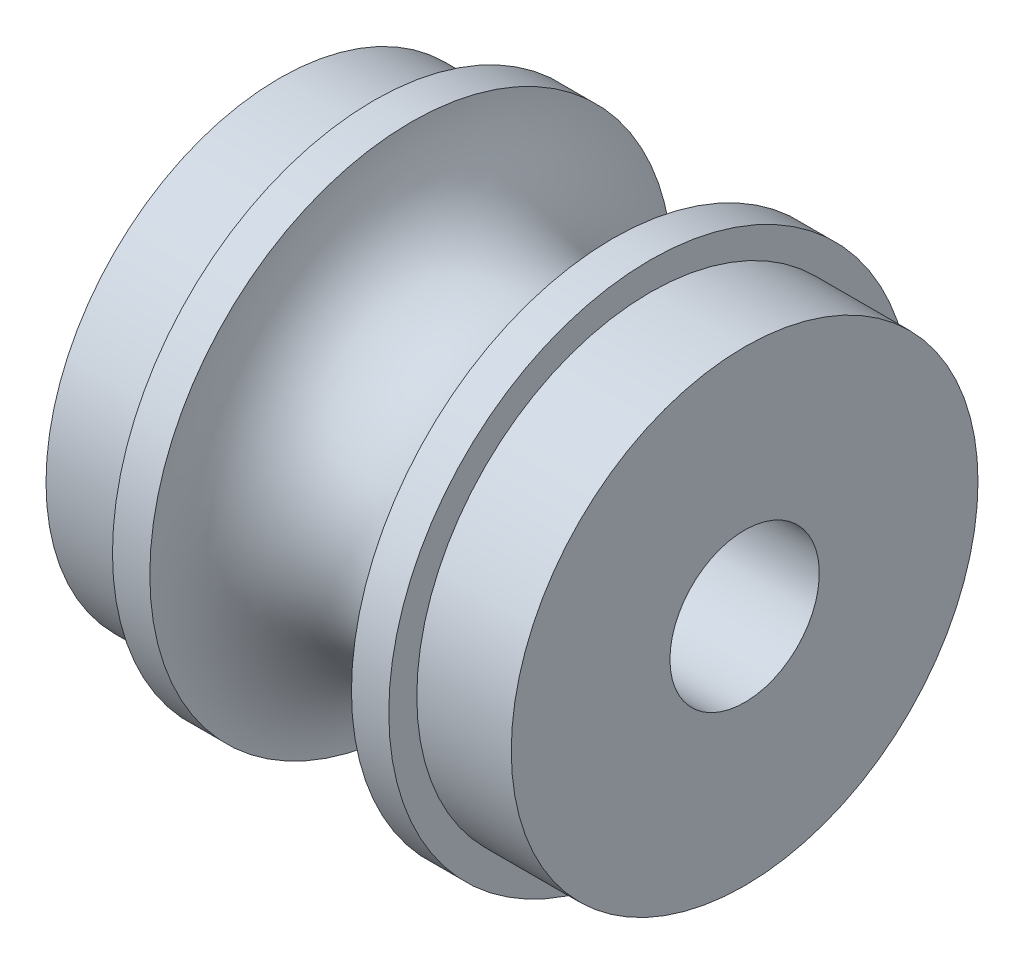
ISO-10303-21;
HEADER;
FILE_DESCRIPTION(('STEP AP214'),'2;1');
FILE_NAME('part.step','',(''),(''),'','','');
FILE_SCHEMA(('AUTOMOTIVE_DESIGN { 1 0 10303 214 1 1 1 1 }'));
ENDSEC;
DATA;
#1=APPLICATION_CONTEXT('core data for automotive mechanical design processes');
#2=APPLICATION_PROTOCOL_DEFINITION('international standard','automotive_design',2000,#1);
#3=PRODUCT_CONTEXT('',#1,'mechanical');
#4=PRODUCT('Part','Part','',(#3));
#5=PRODUCT_RELATED_PRODUCT_CATEGORY('part','',(#4));
#6=PRODUCT_DEFINITION_FORMATION('','',#4);
#7=PRODUCT_DEFINITION_CONTEXT('part definition',#1,'design');
#8=PRODUCT_DEFINITION('design','',#6,#7);
#9=PRODUCT_DEFINITION_SHAPE('','',#8);
#10=(LENGTH_UNIT() NAMED_UNIT(*) SI_UNIT(.MILLI.,.METRE.));
#11=(NAMED_UNIT(*) PLANE_ANGLE_UNIT() SI_UNIT($,.RADIAN.));
#12=(NAMED_UNIT(*) SI_UNIT($,.STERADIAN.) SOLID_ANGLE_UNIT());
#13=UNCERTAINTY_MEASURE_WITH_UNIT(LENGTH_MEASURE(1.E-05),#10,'distance_accuracy_value','');
#14=(GEOMETRIC_REPRESENTATION_CONTEXT(3) GLOBAL_UNCERTAINTY_ASSIGNED_CONTEXT((#13)) GLOBAL_UNIT_ASSIGNED_CONTEXT((#10,
#11,#12)) REPRESENTATION_CONTEXT('',''));
#15=CARTESIAN_POINT('',(0.,0.,0.));
#16=DIRECTION('',(0.,0.,1.));
#17=DIRECTION('',(1.,0.,0.));
#18=AXIS2_PLACEMENT_3D('',#15,#16,#17);
#19=CARTESIAN_POINT('',(3.429,0.,0.));
#20=DIRECTION('',(-1.,0.,0.));
#21=DIRECTION('',(0.,0.,1.));
#22=AXIS2_PLACEMENT_3D('',#19,#20,#21);
#23=TOROIDAL_SURFACE('',#22,8.89,3.429);
#24=CARTESIAN_POINT('',(6.858,0.,0.));
#25=DIRECTION('',(-1.,0.,0.));
#26=DIRECTION('',(0.,0.,1.));
#27=AXIS2_PLACEMENT_3D('',#24,#25,#26);
#28=CIRCLE('',#27,8.89);
#29=CARTESIAN_POINT('',(6.858,0.,8.89));
#30=VERTEX_POINT('',#29);
#31=EDGE_CURVE('E61',#30,#30,#28,.T.);
#32=ORIENTED_EDGE('',*,*,#31,.T.);
#33=EDGE_LOOP('',(#32));
#34=FACE_BOUND('',#33,.T.);
#35=CARTESIAN_POINT('',(0.,0.,0.));
#36=DIRECTION('',(-1.,0.,0.));
#37=DIRECTION('',(0.,0.,1.));
#38=AXIS2_PLACEMENT_3D('',#35,#36,#37);
#39=CIRCLE('',#38,8.89);
#40=CARTESIAN_POINT('',(0.,0.,8.89));
#41=VERTEX_POINT('',#40);
#42=EDGE_CURVE('E42',#41,#41,#39,.T.);
#43=ORIENTED_EDGE('',*,*,#42,.F.);
#44=EDGE_LOOP('',(#43));
#45=FACE_BOUND('',#44,.T.);
#46=ADVANCED_FACE('F39',(#34,#45),#23,.F.);
#47=CARTESIAN_POINT('',(0.,0.,0.));
#48=DIRECTION('',(-1.,0.,0.));
#49=DIRECTION('',(0.,0.,1.));
#50=AXIS2_PLACEMENT_3D('',#47,#48,#49);
#51=CYLINDRICAL_SURFACE('',#50,8.89);
#52=CARTESIAN_POINT('',(-1.27,0.,0.));
#53=DIRECTION('',(-1.,0.,0.));
#54=DIRECTION('',(0.,0.,1.));
#55=AXIS2_PLACEMENT_3D('',#52,#53,#54);
#56=CIRCLE('',#55,8.89);
#57=CARTESIAN_POINT('',(-1.27,0.,8.89));
#58=VERTEX_POINT('',#57);
#59=EDGE_CURVE('E69',#58,#58,#56,.T.);
#60=ORIENTED_EDGE('',*,*,#59,.F.);
#61=EDGE_LOOP('',(#60));
#62=FACE_BOUND('',#61,.T.);
#63=ORIENTED_EDGE('',*,*,#42,.T.);
#64=EDGE_LOOP('',(#63));
#65=FACE_BOUND('',#64,.T.);
#66=ADVANCED_FACE('F78',(#62,#65),#51,.T.);
#67=CARTESIAN_POINT('',(-1.27,0.,0.));
#68=DIRECTION('',(-1.,0.,0.));
#69=DIRECTION('',(0.,0.,1.));
#70=AXIS2_PLACEMENT_3D('',#67,#68,#69);
#71=PLANE('',#70);
#72=CARTESIAN_POINT('',(-1.27,0.,0.));
#73=DIRECTION('',(-1.,0.,0.));
#74=DIRECTION('',(0.,0.,1.));
#75=AXIS2_PLACEMENT_3D('',#72,#73,#74);
#76=CIRCLE('',#75,7.9375);
#77=CARTESIAN_POINT('',(-1.27,0.,7.9375));
#78=VERTEX_POINT('',#77);
#79=EDGE_CURVE('E10',#78,#78,#76,.T.);
#80=ORIENTED_EDGE('',*,*,#79,.F.);
#81=EDGE_LOOP('',(#80));
#82=FACE_BOUND('',#81,.T.);
#83=ORIENTED_EDGE('',*,*,#59,.T.);
#84=EDGE_LOOP('',(#83));
#85=FACE_BOUND('',#84,.T.);
#86=ADVANCED_FACE('F85',(#82,#85),#71,.T.);
#87=CARTESIAN_POINT('',(8.128,0.,0.));
#88=DIRECTION('',(1.,0.,0.));
#89=DIRECTION('',(0.,0.,-1.));
#90=AXIS2_PLACEMENT_3D('',#87,#88,#89);
#91=PLANE('',#90);
#92=CARTESIAN_POINT('',(8.128,0.,0.));
#93=DIRECTION('',(1.,0.,0.));
#94=DIRECTION('',(0.,0.,-1.));
#95=AXIS2_PLACEMENT_3D('',#92,#93,#94);
#96=CIRCLE('',#95,7.9375);
#97=CARTESIAN_POINT('',(8.128,0.,-7.9375));
#98=VERTEX_POINT('',#97);
#99=EDGE_CURVE('E47',#98,#98,#96,.T.);
#100=ORIENTED_EDGE('',*,*,#99,.F.);
#101=EDGE_LOOP('',(#100));
#102=FACE_BOUND('',#101,.T.);
#103=CARTESIAN_POINT('',(8.128,0.,0.));
#104=DIRECTION('',(-1.,0.,0.));
#105=DIRECTION('',(0.,0.,1.));
#106=AXIS2_PLACEMENT_3D('',#103,#104,#105);
#107=CIRCLE('',#106,8.89);
#108=CARTESIAN_POINT('',(8.128,0.,8.89));
#109=VERTEX_POINT('',#108);
#110=EDGE_CURVE('E66',#109,#109,#107,.T.);
#111=ORIENTED_EDGE('',*,*,#110,.F.);
#112=EDGE_LOOP('',(#111));
#113=FACE_BOUND('',#112,.T.);
#114=ADVANCED_FACE('F92',(#102,#113),#91,.T.);
#115=CARTESIAN_POINT('',(0.,0.,0.));
#116=DIRECTION('',(-1.,0.,0.));
#117=DIRECTION('',(0.,0.,1.));
#118=AXIS2_PLACEMENT_3D('',#115,#116,#117);
#119=CYLINDRICAL_SURFACE('',#118,8.89);
#120=ORIENTED_EDGE('',*,*,#110,.T.);
#121=EDGE_LOOP('',(#120));
#122=FACE_BOUND('',#121,.T.);
#123=ORIENTED_EDGE('',*,*,#31,.F.);
#124=EDGE_LOOP('',(#123));
#125=FACE_BOUND('',#124,.T.);
#126=ADVANCED_FACE('F89',(#122,#125),#119,.T.);
#127=CARTESIAN_POINT('',(11.3411,0.,0.));
#128=DIRECTION('',(-1.,0.,0.));
#129=DIRECTION('',(0.,0.,1.));
#130=AXIS2_PLACEMENT_3D('',#127,#128,#129);
#131=CYLINDRICAL_SURFACE('',#130,7.9375);
#132=CARTESIAN_POINT('',(11.3411,0.,0.));
#133=DIRECTION('',(1.,0.,0.));
#134=DIRECTION('',(0.,0.,-1.));
#135=AXIS2_PLACEMENT_3D('',#132,#133,#134);
#136=CIRCLE('',#135,7.9375);
#137=CARTESIAN_POINT('',(11.3411,0.,-7.9375));
#138=VERTEX_POINT('',#137);
#139=EDGE_CURVE('E58',#138,#138,#136,.T.);
#140=ORIENTED_EDGE('',*,*,#139,.F.);
#141=EDGE_LOOP('',(#140));
#142=FACE_BOUND('',#141,.T.);
#143=ORIENTED_EDGE('',*,*,#99,.T.);
#144=EDGE_LOOP('',(#143));
#145=FACE_BOUND('',#144,.T.);
#146=ADVANCED_FACE('F91',(#142,#145),#131,.T.);
#147=CARTESIAN_POINT('',(11.3411,0.,0.));
#148=DIRECTION('',(1.,0.,0.));
#149=DIRECTION('',(0.,0.,-1.));
#150=AXIS2_PLACEMENT_3D('',#147,#148,#149);
#151=PLANE('',#150);
#152=CARTESIAN_POINT('',(11.3411,0.,0.));
#153=DIRECTION('',(-1.,0.,0.));
#154=DIRECTION('',(0.,0.,1.));
#155=AXIS2_PLACEMENT_3D('',#152,#153,#154);
#156=CIRCLE('',#155,2.54);
#157=CARTESIAN_POINT('',(11.3411,0.,2.54));
#158=VERTEX_POINT('',#157);
#159=EDGE_CURVE('E169',#158,#158,#156,.T.);
#160=ORIENTED_EDGE('',*,*,#159,.T.);
#161=EDGE_LOOP('',(#160));
#162=FACE_BOUND('',#161,.T.);
#163=ORIENTED_EDGE('',*,*,#139,.T.);
#164=EDGE_LOOP('',(#163));
#165=FACE_BOUND('',#164,.T.);
#166=ADVANCED_FACE('F99',(#162,#165),#151,.T.);
#167=CARTESIAN_POINT('',(-4.4831,0.,0.));
#168=DIRECTION('',(1.,0.,0.));
#169=DIRECTION('',(0.,0.,-1.));
#170=AXIS2_PLACEMENT_3D('',#167,#168,#169);
#171=CYLINDRICAL_SURFACE('',#170,7.9375);
#172=CARTESIAN_POINT('',(-4.4831,0.,0.));
#173=DIRECTION('',(-1.,0.,0.));
#174=DIRECTION('',(0.,0.,1.));
#175=AXIS2_PLACEMENT_3D('',#172,#173,#174);
#176=CIRCLE('',#175,7.9375);
#177=CARTESIAN_POINT('',(-4.4831,0.,7.9375));
#178=VERTEX_POINT('',#177);
#179=EDGE_CURVE('E56',#178,#178,#176,.T.);
#180=ORIENTED_EDGE('',*,*,#179,.F.);
#181=EDGE_LOOP('',(#180));
#182=FACE_BOUND('',#181,.T.);
#183=ORIENTED_EDGE('',*,*,#79,.T.);
#184=EDGE_LOOP('',(#183));
#185=FACE_BOUND('',#184,.T.);
#186=ADVANCED_FACE('F134',(#182,#185),#171,.T.);
#187=CARTESIAN_POINT('',(-4.4831,0.,0.));
#188=DIRECTION('',(-1.,0.,0.));
#189=DIRECTION('',(0.,0.,1.));
#190=AXIS2_PLACEMENT_3D('',#187,#188,#189);
#191=PLANE('',#190);
#192=CARTESIAN_POINT('',(-4.4831,0.,0.));
#193=DIRECTION('',(-1.,0.,0.));
#194=DIRECTION('',(0.,0.,1.));
#195=AXIS2_PLACEMENT_3D('',#192,#193,#194);
#196=CIRCLE('',#195,2.54);
#197=CARTESIAN_POINT('',(-4.4831,0.,2.54));
#198=VERTEX_POINT('',#197);
#199=EDGE_CURVE('E172',#198,#198,#196,.T.);
#200=ORIENTED_EDGE('',*,*,#199,.F.);
#201=EDGE_LOOP('',(#200));
#202=FACE_BOUND('',#201,.T.);
#203=ORIENTED_EDGE('',*,*,#179,.T.);
#204=EDGE_LOOP('',(#203));
#205=FACE_BOUND('',#204,.T.);
#206=ADVANCED_FACE('F140',(#202,#205),#191,.T.);
#207=CARTESIAN_POINT('',(11.3411,0.,0.));
#208=DIRECTION('',(-1.,0.,0.));
#209=DIRECTION('',(0.,0.,1.));
#210=AXIS2_PLACEMENT_3D('',#207,#208,#209);
#211=CYLINDRICAL_SURFACE('',#210,2.54);
#212=ORIENTED_EDGE('',*,*,#159,.F.);
#213=EDGE_LOOP('',(#212));
#214=FACE_BOUND('',#213,.T.);
#215=ORIENTED_EDGE('',*,*,#199,.T.);
#216=EDGE_LOOP('',(#215));
#217=FACE_BOUND('',#216,.T.);
#218=ADVANCED_FACE('F147',(#214,#217),#211,.F.);
#219=CLOSED_SHELL('',(#46,#66,#86,#114,#126,#146,#166,#186,#206,#218));
#220=MANIFOLD_SOLID_BREP('B2',#219);
#221=ADVANCED_BREP_SHAPE_REPRESENTATION('',(#18,#220),#14);
#222=SHAPE_DEFINITION_REPRESENTATION(#9,#221);
ENDSEC;
END-ISO-10303-21;
